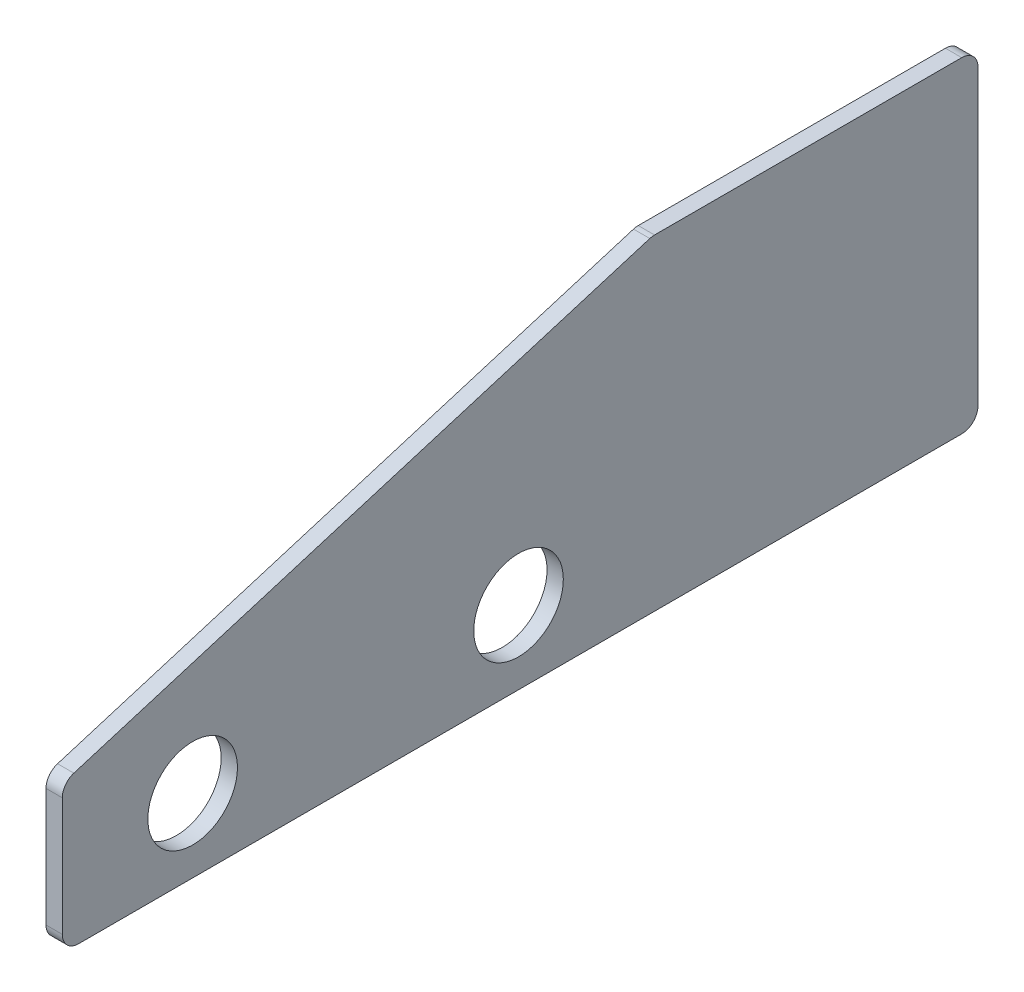
ISO-10303-21;
HEADER;
FILE_DESCRIPTION(('STEP AP214'),'2;1');
FILE_NAME('part.step','',(''),(''),'','','');
FILE_SCHEMA(('AUTOMOTIVE_DESIGN { 1 0 10303 214 1 1 1 1 }'));
ENDSEC;
DATA;
#1=APPLICATION_CONTEXT('core data for automotive mechanical design processes');
#2=APPLICATION_PROTOCOL_DEFINITION('international standard','automotive_design',2000,#1);
#3=PRODUCT_CONTEXT('',#1,'mechanical');
#4=PRODUCT('Part','Part','',(#3));
#5=PRODUCT_RELATED_PRODUCT_CATEGORY('part','',(#4));
#6=PRODUCT_DEFINITION_FORMATION('','',#4);
#7=PRODUCT_DEFINITION_CONTEXT('part definition',#1,'design');
#8=PRODUCT_DEFINITION('design','',#6,#7);
#9=PRODUCT_DEFINITION_SHAPE('','',#8);
#10=(LENGTH_UNIT() NAMED_UNIT(*) SI_UNIT(.MILLI.,.METRE.));
#11=(NAMED_UNIT(*) PLANE_ANGLE_UNIT() SI_UNIT($,.RADIAN.));
#12=(NAMED_UNIT(*) SI_UNIT($,.STERADIAN.) SOLID_ANGLE_UNIT());
#13=UNCERTAINTY_MEASURE_WITH_UNIT(LENGTH_MEASURE(1.E-05),#10,'distance_accuracy_value','');
#14=(GEOMETRIC_REPRESENTATION_CONTEXT(3) GLOBAL_UNCERTAINTY_ASSIGNED_CONTEXT((#13)) GLOBAL_UNIT_ASSIGNED_CONTEXT((#10,
#11,#12)) REPRESENTATION_CONTEXT('',''));
#15=CARTESIAN_POINT('',(0.,0.,0.));
#16=DIRECTION('',(0.,0.,1.));
#17=DIRECTION('',(1.,0.,0.));
#18=AXIS2_PLACEMENT_3D('',#15,#16,#17);
#19=CARTESIAN_POINT('',(-0.5,9.,0.));
#20=DIRECTION('',(0.,0.,1.));
#21=DIRECTION('',(0.,-1.,0.));
#22=AXIS2_PLACEMENT_3D('',#19,#20,#21);
#23=PLANE('',#22);
#24=DIRECTION('',(0.,-1.,0.));
#25=VECTOR('',#24,1.);
#26=CARTESIAN_POINT('',(-0.5,9.,0.));
#27=LINE('',#26,#25);
#28=CARTESIAN_POINT('',(-0.5,8.25871889769605,0.));
#29=VERTEX_POINT('',#28);
#30=CARTESIAN_POINT('',(-0.5,0.999999999999999,0.));
#31=VERTEX_POINT('',#30);
#32=EDGE_CURVE('E177',#29,#31,#27,.T.);
#33=ORIENTED_EDGE('',*,*,#32,.T.);
#34=DIRECTION('',(1.,0.,0.));
#35=VECTOR('',#34,1.);
#36=CARTESIAN_POINT('',(-0.5,0.999999999999999,0.));
#37=LINE('',#36,#35);
#38=CARTESIAN_POINT('',(0.5,0.999999999999999,0.));
#39=VERTEX_POINT('',#38);
#40=EDGE_CURVE('E11',#31,#39,#37,.T.);
#41=ORIENTED_EDGE('',*,*,#40,.T.);
#42=DIRECTION('',(0.,-1.,0.));
#43=VECTOR('',#42,1.);
#44=CARTESIAN_POINT('',(0.5,9.,0.));
#45=LINE('',#44,#43);
#46=CARTESIAN_POINT('',(0.5,8.25871889769605,0.));
#47=VERTEX_POINT('',#46);
#48=EDGE_CURVE('E180',#47,#39,#45,.T.);
#49=ORIENTED_EDGE('',*,*,#48,.F.);
#50=DIRECTION('',(1.,0.,0.));
#51=VECTOR('',#50,1.);
#52=CARTESIAN_POINT('',(-0.5,8.25871889769605,0.));
#53=LINE('',#52,#51);
#54=EDGE_CURVE('E41',#47,#29,#53,.F.);
#55=ORIENTED_EDGE('',*,*,#54,.T.);
#56=EDGE_LOOP('',(#33,#41,#49,#55));
#57=FACE_BOUND('',#56,.T.);
#58=ADVANCED_FACE('F33',(#57),#23,.T.);
#59=CARTESIAN_POINT('',(-0.5,20.,-36.2));
#60=DIRECTION('',(0.,0.956801827322967,0.290740886755598));
#61=DIRECTION('',(0.,-0.290740886755598,0.956801827322967));
#62=AXIS2_PLACEMENT_3D('',#59,#60,#61);
#63=PLANE('',#62);
#64=DIRECTION('',(0.,-0.290740886755598,0.956801827322967));
#65=VECTOR('',#64,1.);
#66=CARTESIAN_POINT('',(0.5,20.,-36.2));
#67=LINE('',#66,#65);
#68=CARTESIAN_POINT('',(0.5,19.956801827323,-36.0578387408265));
#69=VERTEX_POINT('',#68);
#70=CARTESIAN_POINT('',(0.5,9.21552072501902,-0.709259113244397));
#71=VERTEX_POINT('',#70);
#72=EDGE_CURVE('E133',#69,#71,#67,.T.);
#73=ORIENTED_EDGE('',*,*,#72,.F.);
#74=DIRECTION('',(1.,0.,0.));
#75=VECTOR('',#74,1.);
#76=CARTESIAN_POINT('',(-0.5,19.956801827323,-36.0578387408265));
#77=LINE('',#76,#75);
#78=CARTESIAN_POINT('',(-0.5,19.956801827323,-36.0578387408265));
#79=VERTEX_POINT('',#78);
#80=EDGE_CURVE('E155',#69,#79,#77,.F.);
#81=ORIENTED_EDGE('',*,*,#80,.T.);
#82=DIRECTION('',(0.,-0.290740886755598,0.956801827322967));
#83=VECTOR('',#82,1.);
#84=CARTESIAN_POINT('',(-0.5,20.,-36.2));
#85=LINE('',#84,#83);
#86=CARTESIAN_POINT('',(-0.5,9.21552072501902,-0.709259113244397));
#87=VERTEX_POINT('',#86);
#88=EDGE_CURVE('E138',#79,#87,#85,.T.);
#89=ORIENTED_EDGE('',*,*,#88,.T.);
#90=DIRECTION('',(1.,0.,0.));
#91=VECTOR('',#90,1.);
#92=CARTESIAN_POINT('',(-0.5,9.21552072501902,-0.709259113244397));
#93=LINE('',#92,#91);
#94=EDGE_CURVE('E152',#87,#71,#93,.T.);
#95=ORIENTED_EDGE('',*,*,#94,.T.);
#96=EDGE_LOOP('',(#73,#81,#89,#95));
#97=FACE_BOUND('',#96,.T.);
#98=ADVANCED_FACE('F192',(#97),#63,.T.);
#99=CARTESIAN_POINT('',(-0.5,20.,-56.2));
#100=DIRECTION('',(0.,1.,0.));
#101=DIRECTION('',(0.,0.,1.));
#102=AXIS2_PLACEMENT_3D('',#99,#100,#101);
#103=PLANE('',#102);
#104=DIRECTION('',(0.,0.,1.));
#105=VECTOR('',#104,1.);
#106=CARTESIAN_POINT('',(-0.5,20.,-56.2));
#107=LINE('',#106,#105);
#108=CARTESIAN_POINT('',(-0.5,20.,-55.2));
#109=VERTEX_POINT('',#108);
#110=CARTESIAN_POINT('',(-0.5,20.,-36.3485796275821));
#111=VERTEX_POINT('',#110);
#112=EDGE_CURVE('E143',#109,#111,#107,.T.);
#113=ORIENTED_EDGE('',*,*,#112,.T.);
#114=DIRECTION('',(1.,0.,0.));
#115=VECTOR('',#114,1.);
#116=CARTESIAN_POINT('',(-0.5,20.,-36.3485796275821));
#117=LINE('',#116,#115);
#118=CARTESIAN_POINT('',(0.5,20.,-36.3485796275821));
#119=VERTEX_POINT('',#118);
#120=EDGE_CURVE('E132',#111,#119,#117,.T.);
#121=ORIENTED_EDGE('',*,*,#120,.T.);
#122=DIRECTION('',(0.,0.,1.));
#123=VECTOR('',#122,1.);
#124=CARTESIAN_POINT('',(0.5,20.,-56.2));
#125=LINE('',#124,#123);
#126=CARTESIAN_POINT('',(0.5,20.,-55.2));
#127=VERTEX_POINT('',#126);
#128=EDGE_CURVE('E115',#127,#119,#125,.T.);
#129=ORIENTED_EDGE('',*,*,#128,.F.);
#130=DIRECTION('',(1.,0.,0.));
#131=VECTOR('',#130,1.);
#132=CARTESIAN_POINT('',(-0.5,20.,-55.2));
#133=LINE('',#132,#131);
#134=EDGE_CURVE('E129',#127,#109,#133,.F.);
#135=ORIENTED_EDGE('',*,*,#134,.T.);
#136=EDGE_LOOP('',(#113,#121,#129,#135));
#137=FACE_BOUND('',#136,.T.);
#138=ADVANCED_FACE('F128',(#137),#103,.T.);
#139=CARTESIAN_POINT('',(-0.5,0.,-56.2));
#140=DIRECTION('',(0.,0.,-1.));
#141=DIRECTION('',(-1.,0.,0.));
#142=AXIS2_PLACEMENT_3D('',#139,#140,#141);
#143=PLANE('',#142);
#144=DIRECTION('',(0.,1.,0.));
#145=VECTOR('',#144,1.);
#146=CARTESIAN_POINT('',(-0.5,0.,-56.2));
#147=LINE('',#146,#145);
#148=CARTESIAN_POINT('',(-0.5,1.,-56.2));
#149=VERTEX_POINT('',#148);
#150=CARTESIAN_POINT('',(-0.5,19.,-56.2));
#151=VERTEX_POINT('',#150);
#152=EDGE_CURVE('E198',#149,#151,#147,.T.);
#153=ORIENTED_EDGE('',*,*,#152,.T.);
#154=DIRECTION('',(1.,0.,0.));
#155=VECTOR('',#154,1.);
#156=CARTESIAN_POINT('',(-0.5,19.,-56.2));
#157=LINE('',#156,#155);
#158=CARTESIAN_POINT('',(0.5,19.,-56.2));
#159=VERTEX_POINT('',#158);
#160=EDGE_CURVE('E167',#151,#159,#157,.T.);
#161=ORIENTED_EDGE('',*,*,#160,.T.);
#162=DIRECTION('',(0.,1.,0.));
#163=VECTOR('',#162,1.);
#164=CARTESIAN_POINT('',(0.5,0.,-56.2));
#165=LINE('',#164,#163);
#166=CARTESIAN_POINT('',(0.5,1.,-56.2));
#167=VERTEX_POINT('',#166);
#168=EDGE_CURVE('E117',#167,#159,#165,.T.);
#169=ORIENTED_EDGE('',*,*,#168,.F.);
#170=DIRECTION('',(1.,0.,0.));
#171=VECTOR('',#170,1.);
#172=CARTESIAN_POINT('',(-0.5,1.,-56.2));
#173=LINE('',#172,#171);
#174=EDGE_CURVE('E165',#167,#149,#173,.F.);
#175=ORIENTED_EDGE('',*,*,#174,.T.);
#176=EDGE_LOOP('',(#153,#161,#169,#175));
#177=FACE_BOUND('',#176,.T.);
#178=ADVANCED_FACE('F223',(#177),#143,.T.);
#179=CARTESIAN_POINT('',(-0.5,0.,0.));
#180=DIRECTION('',(0.,-1.,0.));
#181=DIRECTION('',(0.,0.,-1.));
#182=AXIS2_PLACEMENT_3D('',#179,#180,#181);
#183=PLANE('',#182);
#184=DIRECTION('',(0.,0.,-1.));
#185=VECTOR('',#184,1.);
#186=CARTESIAN_POINT('',(-0.5,0.,0.));
#187=LINE('',#186,#185);
#188=CARTESIAN_POINT('',(-0.5,0.,-1.));
#189=VERTEX_POINT('',#188);
#190=CARTESIAN_POINT('',(-0.5,0.,-55.2));
#191=VERTEX_POINT('',#190);
#192=EDGE_CURVE('E186',#189,#191,#187,.T.);
#193=ORIENTED_EDGE('',*,*,#192,.T.);
#194=DIRECTION('',(1.,0.,0.));
#195=VECTOR('',#194,1.);
#196=CARTESIAN_POINT('',(-0.5,0.,-55.2));
#197=LINE('',#196,#195);
#198=CARTESIAN_POINT('',(0.5,0.,-55.2));
#199=VERTEX_POINT('',#198);
#200=EDGE_CURVE('E170',#191,#199,#197,.T.);
#201=ORIENTED_EDGE('',*,*,#200,.T.);
#202=DIRECTION('',(0.,0.,-1.));
#203=VECTOR('',#202,1.);
#204=CARTESIAN_POINT('',(0.5,0.,0.));
#205=LINE('',#204,#203);
#206=CARTESIAN_POINT('',(0.5,0.,-1.));
#207=VERTEX_POINT('',#206);
#208=EDGE_CURVE('E258',#207,#199,#205,.T.);
#209=ORIENTED_EDGE('',*,*,#208,.F.);
#210=DIRECTION('',(1.,0.,0.));
#211=VECTOR('',#210,1.);
#212=CARTESIAN_POINT('',(-0.5,0.,-1.));
#213=LINE('',#212,#211);
#214=EDGE_CURVE('E55',#207,#189,#213,.F.);
#215=ORIENTED_EDGE('',*,*,#214,.T.);
#216=EDGE_LOOP('',(#193,#201,#209,#215));
#217=FACE_BOUND('',#216,.T.);
#218=ADVANCED_FACE('F220',(#217),#183,.T.);
#219=CARTESIAN_POINT('',(-0.5,0.,0.));
#220=DIRECTION('',(1.,0.,0.));
#221=DIRECTION('',(0.,0.,-1.));
#222=AXIS2_PLACEMENT_3D('',#219,#220,#221);
#223=PLANE('',#222);
#224=CARTESIAN_POINT('',(-0.5,4.5,-8.));
#225=DIRECTION('',(1.,0.,0.));
#226=DIRECTION('',(0.,0.,-1.));
#227=AXIS2_PLACEMENT_3D('',#224,#225,#226);
#228=CIRCLE('',#227,2.75);
#229=CARTESIAN_POINT('',(-0.5,4.5,-10.75));
#230=VERTEX_POINT('',#229);
#231=EDGE_CURVE('E244',#230,#230,#228,.T.);
#232=ORIENTED_EDGE('',*,*,#231,.T.);
#233=EDGE_LOOP('',(#232));
#234=FACE_BOUND('',#233,.T.);
#235=CARTESIAN_POINT('',(-0.5,4.5,-28.));
#236=DIRECTION('',(1.,0.,0.));
#237=DIRECTION('',(0.,0.,-1.));
#238=AXIS2_PLACEMENT_3D('',#235,#236,#237);
#239=CIRCLE('',#238,2.75);
#240=CARTESIAN_POINT('',(-0.5,4.5,-30.75));
#241=VERTEX_POINT('',#240);
#242=EDGE_CURVE('E248',#241,#241,#239,.T.);
#243=ORIENTED_EDGE('',*,*,#242,.T.);
#244=EDGE_LOOP('',(#243));
#245=FACE_BOUND('',#244,.T.);
#246=ORIENTED_EDGE('',*,*,#88,.F.);
#247=CARTESIAN_POINT('',(-0.5,19.,-36.3485796275821));
#248=DIRECTION('',(1.,0.,0.));
#249=DIRECTION('',(0.,0.,-1.));
#250=AXIS2_PLACEMENT_3D('',#247,#248,#249);
#251=CIRCLE('',#250,1.);
#252=EDGE_CURVE('E163',#79,#111,#251,.F.);
#253=ORIENTED_EDGE('',*,*,#252,.T.);
#254=ORIENTED_EDGE('',*,*,#112,.F.);
#255=CARTESIAN_POINT('',(-0.5,19.,-55.2));
#256=DIRECTION('',(1.,0.,0.));
#257=DIRECTION('',(0.,0.,-1.));
#258=AXIS2_PLACEMENT_3D('',#255,#256,#257);
#259=CIRCLE('',#258,1.);
#260=EDGE_CURVE('E137',#109,#151,#259,.F.);
#261=ORIENTED_EDGE('',*,*,#260,.T.);
#262=ORIENTED_EDGE('',*,*,#152,.F.);
#263=CARTESIAN_POINT('',(-0.5,1.,-55.2));
#264=DIRECTION('',(1.,0.,0.));
#265=DIRECTION('',(0.,0.,-1.));
#266=AXIS2_PLACEMENT_3D('',#263,#264,#265);
#267=CIRCLE('',#266,1.);
#268=EDGE_CURVE('E48',#149,#191,#267,.F.);
#269=ORIENTED_EDGE('',*,*,#268,.T.);
#270=ORIENTED_EDGE('',*,*,#192,.F.);
#271=CARTESIAN_POINT('',(-0.5,0.999999999999999,-1.));
#272=DIRECTION('',(1.,0.,0.));
#273=DIRECTION('',(0.,0.,-1.));
#274=AXIS2_PLACEMENT_3D('',#271,#272,#273);
#275=CIRCLE('',#274,1.);
#276=EDGE_CURVE('E159',#189,#31,#275,.F.);
#277=ORIENTED_EDGE('',*,*,#276,.T.);
#278=ORIENTED_EDGE('',*,*,#32,.F.);
#279=CARTESIAN_POINT('',(-0.5,8.25871889769605,-1.));
#280=DIRECTION('',(1.,0.,0.));
#281=DIRECTION('',(0.,0.,-1.));
#282=AXIS2_PLACEMENT_3D('',#279,#280,#281);
#283=CIRCLE('',#282,1.);
#284=EDGE_CURVE('E157',#29,#87,#283,.F.);
#285=ORIENTED_EDGE('',*,*,#284,.T.);
#286=EDGE_LOOP('',(#246,#253,#254,#261,#262,#269,#270,#277,#278,#285));
#287=FACE_BOUND('',#286,.T.);
#288=ADVANCED_FACE('F184',(#234,#245,#287),#223,.F.);
#289=CARTESIAN_POINT('',(0.5,0.,0.));
#290=DIRECTION('',(1.,0.,0.));
#291=DIRECTION('',(0.,0.,-1.));
#292=AXIS2_PLACEMENT_3D('',#289,#290,#291);
#293=PLANE('',#292);
#294=CARTESIAN_POINT('',(0.5,4.5,-8.));
#295=DIRECTION('',(1.,0.,0.));
#296=DIRECTION('',(0.,0.,-1.));
#297=AXIS2_PLACEMENT_3D('',#294,#295,#296);
#298=CIRCLE('',#297,2.75);
#299=CARTESIAN_POINT('',(0.5,4.5,-10.75));
#300=VERTEX_POINT('',#299);
#301=EDGE_CURVE('E247',#300,#300,#298,.T.);
#302=ORIENTED_EDGE('',*,*,#301,.F.);
#303=EDGE_LOOP('',(#302));
#304=FACE_BOUND('',#303,.T.);
#305=CARTESIAN_POINT('',(0.5,4.5,-28.));
#306=DIRECTION('',(1.,0.,0.));
#307=DIRECTION('',(0.,0.,-1.));
#308=AXIS2_PLACEMENT_3D('',#305,#306,#307);
#309=CIRCLE('',#308,2.75);
#310=CARTESIAN_POINT('',(0.5,4.5,-30.75));
#311=VERTEX_POINT('',#310);
#312=EDGE_CURVE('E252',#311,#311,#309,.T.);
#313=ORIENTED_EDGE('',*,*,#312,.F.);
#314=EDGE_LOOP('',(#313));
#315=FACE_BOUND('',#314,.T.);
#316=ORIENTED_EDGE('',*,*,#128,.T.);
#317=CARTESIAN_POINT('',(0.5,19.,-36.3485796275821));
#318=DIRECTION('',(1.,0.,0.));
#319=DIRECTION('',(0.,0.,-1.));
#320=AXIS2_PLACEMENT_3D('',#317,#318,#319);
#321=CIRCLE('',#320,1.);
#322=EDGE_CURVE('E122',#119,#69,#321,.T.);
#323=ORIENTED_EDGE('',*,*,#322,.T.);
#324=ORIENTED_EDGE('',*,*,#72,.T.);
#325=CARTESIAN_POINT('',(0.5,8.25871889769605,-1.));
#326=DIRECTION('',(1.,0.,0.));
#327=DIRECTION('',(0.,0.,-1.));
#328=AXIS2_PLACEMENT_3D('',#325,#326,#327);
#329=CIRCLE('',#328,1.);
#330=EDGE_CURVE('E140',#71,#47,#329,.T.);
#331=ORIENTED_EDGE('',*,*,#330,.T.);
#332=ORIENTED_EDGE('',*,*,#48,.T.);
#333=CARTESIAN_POINT('',(0.5,0.999999999999999,-1.));
#334=DIRECTION('',(1.,0.,0.));
#335=DIRECTION('',(0.,0.,-1.));
#336=AXIS2_PLACEMENT_3D('',#333,#334,#335);
#337=CIRCLE('',#336,1.);
#338=EDGE_CURVE('E148',#39,#207,#337,.T.);
#339=ORIENTED_EDGE('',*,*,#338,.T.);
#340=ORIENTED_EDGE('',*,*,#208,.T.);
#341=CARTESIAN_POINT('',(0.5,1.,-55.2));
#342=DIRECTION('',(1.,0.,0.));
#343=DIRECTION('',(0.,0.,-1.));
#344=AXIS2_PLACEMENT_3D('',#341,#342,#343);
#345=CIRCLE('',#344,1.);
#346=EDGE_CURVE('E123',#199,#167,#345,.T.);
#347=ORIENTED_EDGE('',*,*,#346,.T.);
#348=ORIENTED_EDGE('',*,*,#168,.T.);
#349=CARTESIAN_POINT('',(0.5,19.,-55.2));
#350=DIRECTION('',(1.,0.,0.));
#351=DIRECTION('',(0.,0.,-1.));
#352=AXIS2_PLACEMENT_3D('',#349,#350,#351);
#353=CIRCLE('',#352,1.);
#354=EDGE_CURVE('E112',#159,#127,#353,.T.);
#355=ORIENTED_EDGE('',*,*,#354,.T.);
#356=EDGE_LOOP('',(#316,#323,#324,#331,#332,#339,#340,#347,#348,#355));
#357=FACE_BOUND('',#356,.T.);
#358=ADVANCED_FACE('F114',(#304,#315,#357),#293,.T.);
#359=CARTESIAN_POINT('',(-0.5,19.,-36.3485796275821));
#360=DIRECTION('',(1.,0.,0.));
#361=DIRECTION('',(0.,0.,-1.));
#362=AXIS2_PLACEMENT_3D('',#359,#360,#361);
#363=CYLINDRICAL_SURFACE('',#362,1.);
#364=ORIENTED_EDGE('',*,*,#252,.F.);
#365=ORIENTED_EDGE('',*,*,#80,.F.);
#366=ORIENTED_EDGE('',*,*,#322,.F.);
#367=ORIENTED_EDGE('',*,*,#120,.F.);
#368=EDGE_LOOP('',(#364,#365,#366,#367));
#369=FACE_BOUND('',#368,.T.);
#370=ADVANCED_FACE('F202',(#369),#363,.T.);
#371=CARTESIAN_POINT('',(-0.5,19.,-55.2));
#372=DIRECTION('',(1.,0.,0.));
#373=DIRECTION('',(0.,0.,-1.));
#374=AXIS2_PLACEMENT_3D('',#371,#372,#373);
#375=CYLINDRICAL_SURFACE('',#374,1.);
#376=ORIENTED_EDGE('',*,*,#260,.F.);
#377=ORIENTED_EDGE('',*,*,#134,.F.);
#378=ORIENTED_EDGE('',*,*,#354,.F.);
#379=ORIENTED_EDGE('',*,*,#160,.F.);
#380=EDGE_LOOP('',(#376,#377,#378,#379));
#381=FACE_BOUND('',#380,.T.);
#382=ADVANCED_FACE('F136',(#381),#375,.T.);
#383=CARTESIAN_POINT('',(-0.5,1.,-55.2));
#384=DIRECTION('',(1.,0.,0.));
#385=DIRECTION('',(0.,0.,-1.));
#386=AXIS2_PLACEMENT_3D('',#383,#384,#385);
#387=CYLINDRICAL_SURFACE('',#386,1.);
#388=ORIENTED_EDGE('',*,*,#268,.F.);
#389=ORIENTED_EDGE('',*,*,#174,.F.);
#390=ORIENTED_EDGE('',*,*,#346,.F.);
#391=ORIENTED_EDGE('',*,*,#200,.F.);
#392=EDGE_LOOP('',(#388,#389,#390,#391));
#393=FACE_BOUND('',#392,.T.);
#394=ADVANCED_FACE('F209',(#393),#387,.T.);
#395=CARTESIAN_POINT('',(-0.5,0.999999999999999,-1.));
#396=DIRECTION('',(1.,0.,0.));
#397=DIRECTION('',(0.,0.,-1.));
#398=AXIS2_PLACEMENT_3D('',#395,#396,#397);
#399=CYLINDRICAL_SURFACE('',#398,1.);
#400=ORIENTED_EDGE('',*,*,#276,.F.);
#401=ORIENTED_EDGE('',*,*,#214,.F.);
#402=ORIENTED_EDGE('',*,*,#338,.F.);
#403=ORIENTED_EDGE('',*,*,#40,.F.);
#404=EDGE_LOOP('',(#400,#401,#402,#403));
#405=FACE_BOUND('',#404,.T.);
#406=ADVANCED_FACE('F262',(#405),#399,.T.);
#407=CARTESIAN_POINT('',(-0.5,8.25871889769605,-1.));
#408=DIRECTION('',(1.,0.,0.));
#409=DIRECTION('',(0.,0.,-1.));
#410=AXIS2_PLACEMENT_3D('',#407,#408,#409);
#411=CYLINDRICAL_SURFACE('',#410,1.);
#412=ORIENTED_EDGE('',*,*,#284,.F.);
#413=ORIENTED_EDGE('',*,*,#54,.F.);
#414=ORIENTED_EDGE('',*,*,#330,.F.);
#415=ORIENTED_EDGE('',*,*,#94,.F.);
#416=EDGE_LOOP('',(#412,#413,#414,#415));
#417=FACE_BOUND('',#416,.T.);
#418=ADVANCED_FACE('F35',(#417),#411,.T.);
#419=CARTESIAN_POINT('',(-0.5,4.5,-28.));
#420=DIRECTION('',(1.,0.,0.));
#421=DIRECTION('',(0.,0.,-1.));
#422=AXIS2_PLACEMENT_3D('',#419,#420,#421);
#423=CYLINDRICAL_SURFACE('',#422,2.75);
#424=ORIENTED_EDGE('',*,*,#242,.F.);
#425=EDGE_LOOP('',(#424));
#426=FACE_BOUND('',#425,.T.);
#427=ORIENTED_EDGE('',*,*,#312,.T.);
#428=EDGE_LOOP('',(#427));
#429=FACE_BOUND('',#428,.T.);
#430=ADVANCED_FACE('F232',(#426,#429),#423,.F.);
#431=CARTESIAN_POINT('',(-0.5,4.5,-8.));
#432=DIRECTION('',(1.,0.,0.));
#433=DIRECTION('',(0.,0.,-1.));
#434=AXIS2_PLACEMENT_3D('',#431,#432,#433);
#435=CYLINDRICAL_SURFACE('',#434,2.75);
#436=ORIENTED_EDGE('',*,*,#231,.F.);
#437=EDGE_LOOP('',(#436));
#438=FACE_BOUND('',#437,.T.);
#439=ORIENTED_EDGE('',*,*,#301,.T.);
#440=EDGE_LOOP('',(#439));
#441=FACE_BOUND('',#440,.T.);
#442=ADVANCED_FACE('F235',(#438,#441),#435,.F.);
#443=CLOSED_SHELL('',(#58,#98,#138,#178,#218,#288,#358,#370,#382,#394,#406,#418,#430,#442));
#444=MANIFOLD_SOLID_BREP('B2',#443);
#445=ADVANCED_BREP_SHAPE_REPRESENTATION('',(#18,#444),#14);
#446=SHAPE_DEFINITION_REPRESENTATION(#9,#445);
ENDSEC;
END-ISO-10303-21;
